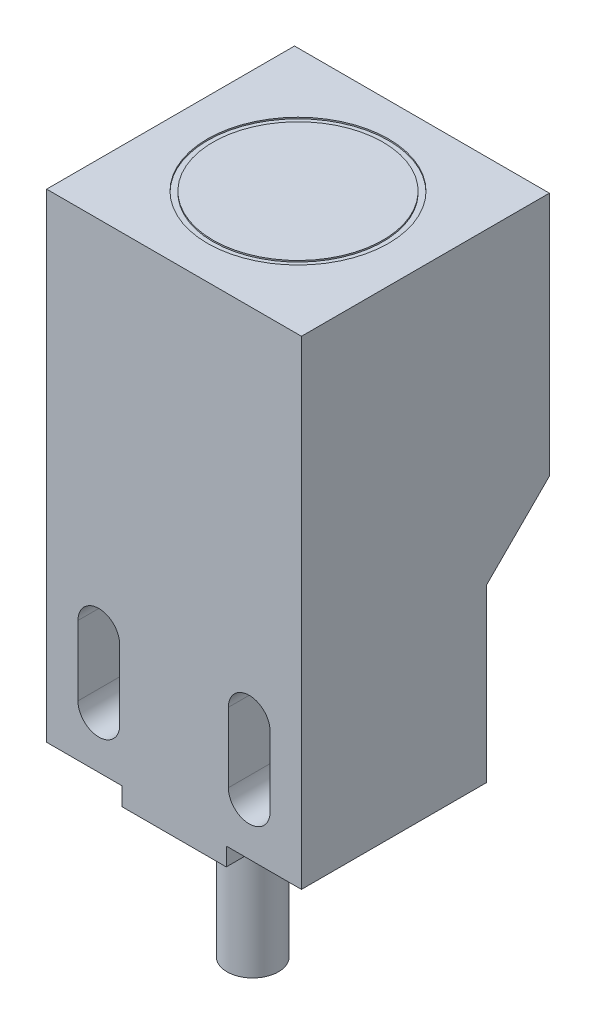
ISO-10303-21;
HEADER;
FILE_DESCRIPTION(('STEP AP214'),'2;1');
FILE_NAME('part.step','',(''),(''),'','','');
FILE_SCHEMA(('AUTOMOTIVE_DESIGN { 1 0 10303 214 1 1 1 1 }'));
ENDSEC;
DATA;
#1=APPLICATION_CONTEXT('core data for automotive mechanical design processes');
#2=APPLICATION_PROTOCOL_DEFINITION('international standard','automotive_design',2000,#1);
#3=PRODUCT_CONTEXT('',#1,'mechanical');
#4=PRODUCT('Part','Part','',(#3));
#5=PRODUCT_RELATED_PRODUCT_CATEGORY('part','',(#4));
#6=PRODUCT_DEFINITION_FORMATION('','',#4);
#7=PRODUCT_DEFINITION_CONTEXT('part definition',#1,'design');
#8=PRODUCT_DEFINITION('design','',#6,#7);
#9=PRODUCT_DEFINITION_SHAPE('','',#8);
#10=(LENGTH_UNIT() NAMED_UNIT(*) SI_UNIT(.MILLI.,.METRE.));
#11=(NAMED_UNIT(*) PLANE_ANGLE_UNIT() SI_UNIT($,.RADIAN.));
#12=(NAMED_UNIT(*) SI_UNIT($,.STERADIAN.) SOLID_ANGLE_UNIT());
#13=UNCERTAINTY_MEASURE_WITH_UNIT(LENGTH_MEASURE(1.E-05),#10,'distance_accuracy_value','');
#14=(GEOMETRIC_REPRESENTATION_CONTEXT(3) GLOBAL_UNCERTAINTY_ASSIGNED_CONTEXT((#13)) GLOBAL_UNIT_ASSIGNED_CONTEXT((#10,
#11,#12)) REPRESENTATION_CONTEXT('',''));
#15=CARTESIAN_POINT('',(0.,0.,0.));
#16=DIRECTION('',(0.,0.,1.));
#17=DIRECTION('',(1.,0.,0.));
#18=AXIS2_PLACEMENT_3D('',#15,#16,#17);
#19=CARTESIAN_POINT('',(0.,-34.4,0.));
#20=DIRECTION('',(0.,1.,0.));
#21=DIRECTION('',(0.,0.,1.));
#22=AXIS2_PLACEMENT_3D('',#19,#20,#21);
#23=PLANE('',#22);
#24=DIRECTION('',(0.,0.,1.));
#25=VECTOR('',#24,1.);
#26=CARTESIAN_POINT('',(3.75,-34.4,8.9));
#27=LINE('',#26,#25);
#28=CARTESIAN_POINT('',(3.75,-34.4,3.25));
#29=VERTEX_POINT('',#28);
#30=CARTESIAN_POINT('',(3.75,-34.4,8.9));
#31=VERTEX_POINT('',#30);
#32=EDGE_CURVE('E51',#29,#31,#27,.T.);
#33=ORIENTED_EDGE('',*,*,#32,.F.);
#34=CARTESIAN_POINT('',(0.,-34.4,3.25));
#35=DIRECTION('',(0.,-1.,0.));
#36=DIRECTION('',(0.,0.,-1.));
#37=AXIS2_PLACEMENT_3D('',#34,#35,#36);
#38=CIRCLE('',#37,3.75);
#39=CARTESIAN_POINT('',(-3.75,-34.4,3.25));
#40=VERTEX_POINT('',#39);
#41=EDGE_CURVE('E507',#40,#29,#38,.T.);
#42=ORIENTED_EDGE('',*,*,#41,.F.);
#43=DIRECTION('',(0.,0.,-1.));
#44=VECTOR('',#43,1.);
#45=CARTESIAN_POINT('',(-3.75,-34.4,8.9));
#46=LINE('',#45,#44);
#47=CARTESIAN_POINT('',(-3.75,-34.4,8.9));
#48=VERTEX_POINT('',#47);
#49=EDGE_CURVE('E501',#48,#40,#46,.T.);
#50=ORIENTED_EDGE('',*,*,#49,.F.);
#51=DIRECTION('',(1.,0.,0.));
#52=VECTOR('',#51,1.);
#53=CARTESIAN_POINT('',(-9.15,-34.4,8.9));
#54=LINE('',#53,#52);
#55=CARTESIAN_POINT('',(-9.15,-34.4,8.9));
#56=VERTEX_POINT('',#55);
#57=EDGE_CURVE('E209',#56,#48,#54,.T.);
#58=ORIENTED_EDGE('',*,*,#57,.F.);
#59=DIRECTION('',(0.,0.,1.));
#60=VECTOR('',#59,1.);
#61=CARTESIAN_POINT('',(-9.15,-34.4,-8.9));
#62=LINE('',#61,#60);
#63=CARTESIAN_POINT('',(-9.15,-34.4,-4.4));
#64=VERTEX_POINT('',#63);
#65=EDGE_CURVE('E289',#64,#56,#62,.T.);
#66=ORIENTED_EDGE('',*,*,#65,.F.);
#67=DIRECTION('',(1.,0.,0.));
#68=VECTOR('',#67,1.);
#69=CARTESIAN_POINT('',(-9.15,-34.4,-4.4));
#70=LINE('',#69,#68);
#71=CARTESIAN_POINT('',(9.15,-34.4,-4.4));
#72=VERTEX_POINT('',#71);
#73=EDGE_CURVE('E280',#64,#72,#70,.T.);
#74=ORIENTED_EDGE('',*,*,#73,.T.);
#75=DIRECTION('',(0.,0.,-1.));
#76=VECTOR('',#75,1.);
#77=CARTESIAN_POINT('',(9.15,-34.4,-8.9));
#78=LINE('',#77,#76);
#79=CARTESIAN_POINT('',(9.15,-34.4,8.9));
#80=VERTEX_POINT('',#79);
#81=EDGE_CURVE('E293',#80,#72,#78,.T.);
#82=ORIENTED_EDGE('',*,*,#81,.F.);
#83=EDGE_CURVE('E56',#31,#80,#54,.T.);
#84=ORIENTED_EDGE('',*,*,#83,.F.);
#85=EDGE_LOOP('',(#33,#42,#50,#58,#66,#74,#82,#84));
#86=FACE_BOUND('',#85,.T.);
#87=ADVANCED_FACE('F35',(#86),#23,.F.);
#88=CARTESIAN_POINT('',(-9.15,-17.6,-8.9));
#89=DIRECTION('',(0.,0.707106781186544,0.707106781186551));
#90=DIRECTION('',(0.,-0.707106781186551,0.707106781186544));
#91=AXIS2_PLACEMENT_3D('',#88,#89,#90);
#92=PLANE('',#91);
#93=CARTESIAN_POINT('',(0.,-19.85,-6.65));
#94=DIRECTION('',(0.,0.707106781186544,0.707106781186551));
#95=DIRECTION('',(0.,-0.707106781186551,0.707106781186544));
#96=AXIS2_PLACEMENT_3D('',#93,#94,#95);
#97=ELLIPSE('',#96,3.46482322781406,2.45);
#98=CARTESIAN_POINT('',(-2.44948974278318,-19.9,-6.6));
#99=VERTEX_POINT('',#98);
#100=CARTESIAN_POINT('',(-1.34164078649984,-17.8,-8.7));
#101=VERTEX_POINT('',#100);
#102=EDGE_CURVE('E222',#99,#101,#97,.F.);
#103=ORIENTED_EDGE('',*,*,#102,.F.);
#104=DIRECTION('',(-1.,0.,0.));
#105=VECTOR('',#104,1.);
#106=CARTESIAN_POINT('',(-9.15,-19.9,-6.6));
#107=LINE('',#106,#105);
#108=CARTESIAN_POINT('',(-4.24970587217516,-19.9,-6.6));
#109=VERTEX_POINT('',#108);
#110=EDGE_CURVE('E338',#99,#109,#107,.T.);
#111=ORIENTED_EDGE('',*,*,#110,.T.);
#112=CARTESIAN_POINT('',(0.,-19.85,-6.65));
#113=DIRECTION('',(0.,0.707106781186544,0.707106781186551));
#114=DIRECTION('',(0.,-0.707106781186551,0.707106781186544));
#115=AXIS2_PLACEMENT_3D('',#112,#113,#114);
#116=ELLIPSE('',#115,6.01040764008562,4.25);
#117=CARTESIAN_POINT('',(-3.60555127546397,-22.1000000000001,-4.4));
#118=VERTEX_POINT('',#117);
#119=EDGE_CURVE('E342',#118,#109,#116,.F.);
#120=ORIENTED_EDGE('',*,*,#119,.F.);
#121=DIRECTION('',(1.,0.,0.));
#122=VECTOR('',#121,1.);
#123=CARTESIAN_POINT('',(-9.15,-22.1000000000001,-4.4));
#124=LINE('',#123,#122);
#125=CARTESIAN_POINT('',(-9.15,-22.1000000000001,-4.4));
#126=VERTEX_POINT('',#125);
#127=EDGE_CURVE('E284',#126,#118,#124,.T.);
#128=ORIENTED_EDGE('',*,*,#127,.F.);
#129=DIRECTION('',(0.,-0.707106781186551,0.707106781186544));
#130=VECTOR('',#129,1.);
#131=CARTESIAN_POINT('',(-9.15,-17.6,-8.9));
#132=LINE('',#131,#130);
#133=CARTESIAN_POINT('',(-9.15,-17.6,-8.9));
#134=VERTEX_POINT('',#133);
#135=EDGE_CURVE('E273',#134,#126,#132,.T.);
#136=ORIENTED_EDGE('',*,*,#135,.F.);
#137=DIRECTION('',(1.,0.,0.));
#138=VECTOR('',#137,1.);
#139=CARTESIAN_POINT('',(-9.15,-17.6,-8.9));
#140=LINE('',#139,#138);
#141=CARTESIAN_POINT('',(9.15,-17.6,-8.9));
#142=VERTEX_POINT('',#141);
#143=EDGE_CURVE('E279',#134,#142,#140,.T.);
#144=ORIENTED_EDGE('',*,*,#143,.T.);
#145=DIRECTION('',(0.,-0.707106781186551,0.707106781186544));
#146=VECTOR('',#145,1.);
#147=CARTESIAN_POINT('',(9.15,-17.6,-8.9));
#148=LINE('',#147,#146);
#149=CARTESIAN_POINT('',(9.15,-22.1000000000001,-4.4));
#150=VERTEX_POINT('',#149);
#151=EDGE_CURVE('E244',#142,#150,#148,.T.);
#152=ORIENTED_EDGE('',*,*,#151,.T.);
#153=CARTESIAN_POINT('',(3.60555127546397,-22.1000000000001,-4.4));
#154=VERTEX_POINT('',#153);
#155=EDGE_CURVE('E287',#154,#150,#124,.T.);
#156=ORIENTED_EDGE('',*,*,#155,.F.);
#157=CARTESIAN_POINT('',(4.24970587217516,-19.9,-6.6));
#158=VERTEX_POINT('',#157);
#159=EDGE_CURVE('E341',#158,#154,#116,.F.);
#160=ORIENTED_EDGE('',*,*,#159,.F.);
#161=CARTESIAN_POINT('',(2.44948974278318,-19.9,-6.6));
#162=VERTEX_POINT('',#161);
#163=EDGE_CURVE('E339',#158,#162,#107,.T.);
#164=ORIENTED_EDGE('',*,*,#163,.T.);
#165=CARTESIAN_POINT('',(1.34164078649984,-17.8,-8.7));
#166=VERTEX_POINT('',#165);
#167=EDGE_CURVE('E219',#166,#162,#97,.F.);
#168=ORIENTED_EDGE('',*,*,#167,.F.);
#169=DIRECTION('',(-1.,0.,0.));
#170=VECTOR('',#169,1.);
#171=CARTESIAN_POINT('',(-9.15,-17.8,-8.7));
#172=LINE('',#171,#170);
#173=EDGE_CURVE('E39',#166,#101,#172,.T.);
#174=ORIENTED_EDGE('',*,*,#173,.T.);
#175=EDGE_LOOP('',(#103,#111,#120,#128,#136,#144,#152,#156,#160,#164,#168,#174));
#176=FACE_BOUND('',#175,.T.);
#177=ADVANCED_FACE('F353',(#176),#92,.F.);
#178=CARTESIAN_POINT('',(-9.15,-34.4,-8.9));
#179=DIRECTION('',(-1.,0.,0.));
#180=DIRECTION('',(0.,0.,1.));
#181=AXIS2_PLACEMENT_3D('',#178,#179,#180);
#182=PLANE('',#181);
#183=DIRECTION('',(0.,-1.,0.));
#184=VECTOR('',#183,1.);
#185=CARTESIAN_POINT('',(-9.15,-22.1000000000001,-4.4));
#186=LINE('',#185,#184);
#187=EDGE_CURVE('E276',#126,#64,#186,.T.);
#188=ORIENTED_EDGE('',*,*,#187,.T.);
#189=ORIENTED_EDGE('',*,*,#65,.T.);
#190=DIRECTION('',(0.,1.,0.));
#191=VECTOR('',#190,1.);
#192=CARTESIAN_POINT('',(-9.15,-34.4,8.9));
#193=LINE('',#192,#191);
#194=CARTESIAN_POINT('',(-9.15,0.,8.9));
#195=VERTEX_POINT('',#194);
#196=EDGE_CURVE('E296',#56,#195,#193,.T.);
#197=ORIENTED_EDGE('',*,*,#196,.T.);
#198=DIRECTION('',(0.,0.,1.));
#199=VECTOR('',#198,1.);
#200=CARTESIAN_POINT('',(-9.15,0.,-8.9));
#201=LINE('',#200,#199);
#202=CARTESIAN_POINT('',(-9.15,0.,-8.9));
#203=VERTEX_POINT('',#202);
#204=EDGE_CURVE('E283',#203,#195,#201,.T.);
#205=ORIENTED_EDGE('',*,*,#204,.F.);
#206=DIRECTION('',(0.,1.,0.));
#207=VECTOR('',#206,1.);
#208=CARTESIAN_POINT('',(-9.15,-34.4,-8.9));
#209=LINE('',#208,#207);
#210=EDGE_CURVE('E307',#134,#203,#209,.T.);
#211=ORIENTED_EDGE('',*,*,#210,.F.);
#212=ORIENTED_EDGE('',*,*,#135,.T.);
#213=EDGE_LOOP('',(#188,#189,#197,#205,#211,#212));
#214=FACE_BOUND('',#213,.T.);
#215=ADVANCED_FACE('F37',(#214),#182,.T.);
#216=CARTESIAN_POINT('',(-9.15,-34.4,-8.9));
#217=DIRECTION('',(0.,0.,-1.));
#218=DIRECTION('',(-1.,0.,0.));
#219=AXIS2_PLACEMENT_3D('',#216,#217,#218);
#220=PLANE('',#219);
#221=ORIENTED_EDGE('',*,*,#143,.F.);
#222=ORIENTED_EDGE('',*,*,#210,.T.);
#223=DIRECTION('',(-1.,0.,0.));
#224=VECTOR('',#223,1.);
#225=CARTESIAN_POINT('',(-9.15,0.,-8.9));
#226=LINE('',#225,#224);
#227=CARTESIAN_POINT('',(9.15,0.,-8.9));
#228=VERTEX_POINT('',#227);
#229=EDGE_CURVE('E291',#228,#203,#226,.T.);
#230=ORIENTED_EDGE('',*,*,#229,.F.);
#231=DIRECTION('',(0.,1.,0.));
#232=VECTOR('',#231,1.);
#233=CARTESIAN_POINT('',(9.15,-34.4,-8.9));
#234=LINE('',#233,#232);
#235=EDGE_CURVE('E310',#142,#228,#234,.T.);
#236=ORIENTED_EDGE('',*,*,#235,.F.);
#237=EDGE_LOOP('',(#221,#222,#230,#236));
#238=FACE_BOUND('',#237,.T.);
#239=ADVANCED_FACE('F378',(#238),#220,.T.);
#240=CARTESIAN_POINT('',(9.15,-34.4,-8.9));
#241=DIRECTION('',(1.,0.,0.));
#242=DIRECTION('',(0.,0.,-1.));
#243=AXIS2_PLACEMENT_3D('',#240,#241,#242);
#244=PLANE('',#243);
#245=DIRECTION('',(0.,-1.,0.));
#246=VECTOR('',#245,1.);
#247=CARTESIAN_POINT('',(9.15,-22.1000000000001,-4.4));
#248=LINE('',#247,#246);
#249=EDGE_CURVE('E271',#150,#72,#248,.T.);
#250=ORIENTED_EDGE('',*,*,#249,.F.);
#251=ORIENTED_EDGE('',*,*,#151,.F.);
#252=ORIENTED_EDGE('',*,*,#235,.T.);
#253=DIRECTION('',(0.,0.,-1.));
#254=VECTOR('',#253,1.);
#255=CARTESIAN_POINT('',(9.15,0.,-8.9));
#256=LINE('',#255,#254);
#257=CARTESIAN_POINT('',(9.15,0.,8.9));
#258=VERTEX_POINT('',#257);
#259=EDGE_CURVE('E302',#258,#228,#256,.T.);
#260=ORIENTED_EDGE('',*,*,#259,.F.);
#261=DIRECTION('',(0.,1.,0.));
#262=VECTOR('',#261,1.);
#263=CARTESIAN_POINT('',(9.15,-34.4,8.9));
#264=LINE('',#263,#262);
#265=EDGE_CURVE('E312',#80,#258,#264,.T.);
#266=ORIENTED_EDGE('',*,*,#265,.F.);
#267=ORIENTED_EDGE('',*,*,#81,.T.);
#268=EDGE_LOOP('',(#250,#251,#252,#260,#266,#267));
#269=FACE_BOUND('',#268,.T.);
#270=ADVANCED_FACE('F381',(#269),#244,.T.);
#271=CARTESIAN_POINT('',(-9.15,-34.4,8.9));
#272=DIRECTION('',(0.,0.,1.));
#273=DIRECTION('',(1.,0.,0.));
#274=AXIS2_PLACEMENT_3D('',#271,#272,#273);
#275=PLANE('',#274);
#276=CARTESIAN_POINT('',(5.4,-30.7,8.9));
#277=DIRECTION('',(0.,0.,1.));
#278=DIRECTION('',(1.,0.,0.));
#279=AXIS2_PLACEMENT_3D('',#276,#277,#278);
#280=CIRCLE('',#279,1.5);
#281=CARTESIAN_POINT('',(3.9,-30.7,8.9));
#282=VERTEX_POINT('',#281);
#283=CARTESIAN_POINT('',(6.89999999999999,-30.7,8.9));
#284=VERTEX_POINT('',#283);
#285=EDGE_CURVE('E229',#282,#284,#280,.T.);
#286=ORIENTED_EDGE('',*,*,#285,.F.);
#287=DIRECTION('',(0.,-1.,0.));
#288=VECTOR('',#287,1.);
#289=CARTESIAN_POINT('',(3.9,-30.7,8.9));
#290=LINE('',#289,#288);
#291=CARTESIAN_POINT('',(3.9,-25.7,8.9));
#292=VERTEX_POINT('',#291);
#293=EDGE_CURVE('E238',#292,#282,#290,.T.);
#294=ORIENTED_EDGE('',*,*,#293,.F.);
#295=CARTESIAN_POINT('',(5.4,-25.7,8.9));
#296=DIRECTION('',(0.,0.,1.));
#297=DIRECTION('',(1.,0.,0.));
#298=AXIS2_PLACEMENT_3D('',#295,#296,#297);
#299=CIRCLE('',#298,1.5);
#300=CARTESIAN_POINT('',(6.89999999999999,-25.7,8.9));
#301=VERTEX_POINT('',#300);
#302=EDGE_CURVE('E235',#301,#292,#299,.T.);
#303=ORIENTED_EDGE('',*,*,#302,.F.);
#304=DIRECTION('',(0.,1.,0.));
#305=VECTOR('',#304,1.);
#306=CARTESIAN_POINT('',(6.89999999999999,-30.7,8.9));
#307=LINE('',#306,#305);
#308=EDGE_CURVE('E231',#284,#301,#307,.T.);
#309=ORIENTED_EDGE('',*,*,#308,.F.);
#310=EDGE_LOOP('',(#286,#294,#303,#309));
#311=FACE_BOUND('',#310,.T.);
#312=CARTESIAN_POINT('',(-5.4,-30.7,8.9));
#313=DIRECTION('',(0.,0.,1.));
#314=DIRECTION('',(-1.,0.,0.));
#315=AXIS2_PLACEMENT_3D('',#312,#313,#314);
#316=CIRCLE('',#315,1.5);
#317=CARTESIAN_POINT('',(-6.89999999999999,-30.7,8.9));
#318=VERTEX_POINT('',#317);
#319=CARTESIAN_POINT('',(-3.9,-30.7,8.9));
#320=VERTEX_POINT('',#319);
#321=EDGE_CURVE('E226',#318,#320,#316,.T.);
#322=ORIENTED_EDGE('',*,*,#321,.F.);
#323=DIRECTION('',(0.,-1.,0.));
#324=VECTOR('',#323,1.);
#325=CARTESIAN_POINT('',(-6.89999999999999,-30.7,8.9));
#326=LINE('',#325,#324);
#327=CARTESIAN_POINT('',(-6.89999999999999,-25.7,8.9));
#328=VERTEX_POINT('',#327);
#329=EDGE_CURVE('E258',#328,#318,#326,.T.);
#330=ORIENTED_EDGE('',*,*,#329,.F.);
#331=CARTESIAN_POINT('',(-5.4,-25.7,8.9));
#332=DIRECTION('',(0.,0.,1.));
#333=DIRECTION('',(-1.,0.,0.));
#334=AXIS2_PLACEMENT_3D('',#331,#332,#333);
#335=CIRCLE('',#334,1.5);
#336=CARTESIAN_POINT('',(-3.9,-25.7,8.9));
#337=VERTEX_POINT('',#336);
#338=EDGE_CURVE('E255',#337,#328,#335,.T.);
#339=ORIENTED_EDGE('',*,*,#338,.F.);
#340=DIRECTION('',(0.,1.,0.));
#341=VECTOR('',#340,1.);
#342=CARTESIAN_POINT('',(-3.9,-30.7,8.9));
#343=LINE('',#342,#341);
#344=EDGE_CURVE('E252',#320,#337,#343,.T.);
#345=ORIENTED_EDGE('',*,*,#344,.F.);
#346=EDGE_LOOP('',(#322,#330,#339,#345));
#347=FACE_BOUND('',#346,.T.);
#348=DIRECTION('',(1.,0.,0.));
#349=VECTOR('',#348,1.);
#350=CARTESIAN_POINT('',(-9.15,0.,8.9));
#351=LINE('',#350,#349);
#352=EDGE_CURVE('E299',#195,#258,#351,.T.);
#353=ORIENTED_EDGE('',*,*,#352,.F.);
#354=ORIENTED_EDGE('',*,*,#196,.F.);
#355=ORIENTED_EDGE('',*,*,#57,.T.);
#356=DIRECTION('',(0.,1.,0.));
#357=VECTOR('',#356,1.);
#358=CARTESIAN_POINT('',(-3.75,-35.7,8.9));
#359=LINE('',#358,#357);
#360=CARTESIAN_POINT('',(-3.75,-35.7,8.9));
#361=VERTEX_POINT('',#360);
#362=EDGE_CURVE('E188',#361,#48,#359,.T.);
#363=ORIENTED_EDGE('',*,*,#362,.F.);
#364=DIRECTION('',(-1.,0.,0.));
#365=VECTOR('',#364,1.);
#366=CARTESIAN_POINT('',(-3.75,-35.7,8.9));
#367=LINE('',#366,#365);
#368=CARTESIAN_POINT('',(3.75,-35.7,8.9));
#369=VERTEX_POINT('',#368);
#370=EDGE_CURVE('E194',#369,#361,#367,.T.);
#371=ORIENTED_EDGE('',*,*,#370,.F.);
#372=DIRECTION('',(0.,1.,0.));
#373=VECTOR('',#372,1.);
#374=CARTESIAN_POINT('',(3.75,-35.7,8.9));
#375=LINE('',#374,#373);
#376=EDGE_CURVE('E505',#369,#31,#375,.T.);
#377=ORIENTED_EDGE('',*,*,#376,.T.);
#378=ORIENTED_EDGE('',*,*,#83,.T.);
#379=ORIENTED_EDGE('',*,*,#265,.T.);
#380=EDGE_LOOP('',(#353,#354,#355,#363,#371,#377,#378,#379));
#381=FACE_BOUND('',#380,.T.);
#382=ADVANCED_FACE('F206',(#311,#347,#381),#275,.T.);
#383=CARTESIAN_POINT('',(0.,0.,0.));
#384=DIRECTION('',(0.,1.,0.));
#385=DIRECTION('',(0.,0.,1.));
#386=AXIS2_PLACEMENT_3D('',#383,#384,#385);
#387=PLANE('',#386);
#388=CARTESIAN_POINT('',(0.,0.,0.));
#389=DIRECTION('',(0.,1.,0.));
#390=DIRECTION('',(0.,0.,1.));
#391=AXIS2_PLACEMENT_3D('',#388,#389,#390);
#392=CIRCLE('',#391,6.5);
#393=CARTESIAN_POINT('',(0.,0.,6.5));
#394=VERTEX_POINT('',#393);
#395=EDGE_CURVE('E491',#394,#394,#392,.T.);
#396=ORIENTED_EDGE('',*,*,#395,.F.);
#397=EDGE_LOOP('',(#396));
#398=FACE_BOUND('',#397,.T.);
#399=ORIENTED_EDGE('',*,*,#204,.T.);
#400=ORIENTED_EDGE('',*,*,#352,.T.);
#401=ORIENTED_EDGE('',*,*,#259,.T.);
#402=ORIENTED_EDGE('',*,*,#229,.T.);
#403=EDGE_LOOP('',(#399,#400,#401,#402));
#404=FACE_BOUND('',#403,.T.);
#405=ADVANCED_FACE('F385',(#398,#404),#387,.T.);
#406=CARTESIAN_POINT('',(-9.15,-22.1000000000001,-4.4));
#407=DIRECTION('',(0.,0.,1.));
#408=DIRECTION('',(0.,-1.,0.));
#409=AXIS2_PLACEMENT_3D('',#406,#407,#408);
#410=PLANE('',#409);
#411=CARTESIAN_POINT('',(0.,-19.85,-4.4));
#412=DIRECTION('',(0.,0.,-1.));
#413=DIRECTION('',(0.,1.,0.));
#414=AXIS2_PLACEMENT_3D('',#411,#412,#413);
#415=CIRCLE('',#414,4.25);
#416=EDGE_CURVE('E227',#154,#118,#415,.T.);
#417=ORIENTED_EDGE('',*,*,#416,.F.);
#418=ORIENTED_EDGE('',*,*,#155,.T.);
#419=ORIENTED_EDGE('',*,*,#249,.T.);
#420=ORIENTED_EDGE('',*,*,#73,.F.);
#421=ORIENTED_EDGE('',*,*,#187,.F.);
#422=ORIENTED_EDGE('',*,*,#127,.T.);
#423=EDGE_LOOP('',(#417,#418,#419,#420,#421,#422));
#424=FACE_BOUND('',#423,.T.);
#425=DIRECTION('',(0.,-1.,0.));
#426=VECTOR('',#425,1.);
#427=CARTESIAN_POINT('',(3.9,-22.1000000000001,-4.4));
#428=LINE('',#427,#426);
#429=CARTESIAN_POINT('',(3.9,-25.7,-4.4));
#430=VERTEX_POINT('',#429);
#431=CARTESIAN_POINT('',(3.9,-30.7,-4.4));
#432=VERTEX_POINT('',#431);
#433=EDGE_CURVE('E332',#430,#432,#428,.T.);
#434=ORIENTED_EDGE('',*,*,#433,.T.);
#435=CARTESIAN_POINT('',(5.4,-30.7,-4.4));
#436=DIRECTION('',(0.,0.,1.));
#437=DIRECTION('',(0.,-1.,0.));
#438=AXIS2_PLACEMENT_3D('',#435,#436,#437);
#439=CIRCLE('',#438,1.5);
#440=CARTESIAN_POINT('',(6.89999999999999,-30.7,-4.4));
#441=VERTEX_POINT('',#440);
#442=EDGE_CURVE('E335',#432,#441,#439,.T.);
#443=ORIENTED_EDGE('',*,*,#442,.T.);
#444=DIRECTION('',(0.,1.,0.));
#445=VECTOR('',#444,1.);
#446=CARTESIAN_POINT('',(6.9,-22.1,-4.4));
#447=LINE('',#446,#445);
#448=CARTESIAN_POINT('',(6.9,-25.7,-4.4));
#449=VERTEX_POINT('',#448);
#450=EDGE_CURVE('E326',#441,#449,#447,.T.);
#451=ORIENTED_EDGE('',*,*,#450,.T.);
#452=CARTESIAN_POINT('',(5.4,-25.7,-4.4));
#453=DIRECTION('',(0.,0.,1.));
#454=DIRECTION('',(0.,-1.,0.));
#455=AXIS2_PLACEMENT_3D('',#452,#453,#454);
#456=CIRCLE('',#455,1.5);
#457=EDGE_CURVE('E329',#449,#430,#456,.T.);
#458=ORIENTED_EDGE('',*,*,#457,.T.);
#459=EDGE_LOOP('',(#434,#443,#451,#458));
#460=FACE_BOUND('',#459,.T.);
#461=DIRECTION('',(0.,-1.,0.));
#462=VECTOR('',#461,1.);
#463=CARTESIAN_POINT('',(-6.89999999999999,-22.1000000000001,-4.4));
#464=LINE('',#463,#462);
#465=CARTESIAN_POINT('',(-6.89999999999999,-25.7,-4.4));
#466=VERTEX_POINT('',#465);
#467=CARTESIAN_POINT('',(-6.89999999999999,-30.7,-4.4));
#468=VERTEX_POINT('',#467);
#469=EDGE_CURVE('E320',#466,#468,#464,.T.);
#470=ORIENTED_EDGE('',*,*,#469,.T.);
#471=CARTESIAN_POINT('',(-5.4,-30.7,-4.4));
#472=DIRECTION('',(0.,0.,1.));
#473=DIRECTION('',(0.,-1.,0.));
#474=AXIS2_PLACEMENT_3D('',#471,#472,#473);
#475=CIRCLE('',#474,1.5);
#476=CARTESIAN_POINT('',(-3.9,-30.7,-4.4));
#477=VERTEX_POINT('',#476);
#478=EDGE_CURVE('E323',#468,#477,#475,.T.);
#479=ORIENTED_EDGE('',*,*,#478,.T.);
#480=DIRECTION('',(0.,1.,0.));
#481=VECTOR('',#480,1.);
#482=CARTESIAN_POINT('',(-3.9,-22.1000000000001,-4.4));
#483=LINE('',#482,#481);
#484=CARTESIAN_POINT('',(-3.9,-25.7,-4.4));
#485=VERTEX_POINT('',#484);
#486=EDGE_CURVE('E309',#477,#485,#483,.T.);
#487=ORIENTED_EDGE('',*,*,#486,.T.);
#488=CARTESIAN_POINT('',(-5.4,-25.7,-4.4));
#489=DIRECTION('',(0.,0.,1.));
#490=DIRECTION('',(0.,-1.,0.));
#491=AXIS2_PLACEMENT_3D('',#488,#489,#490);
#492=CIRCLE('',#491,1.5);
#493=EDGE_CURVE('E317',#485,#466,#492,.T.);
#494=ORIENTED_EDGE('',*,*,#493,.T.);
#495=EDGE_LOOP('',(#470,#479,#487,#494));
#496=FACE_BOUND('',#495,.T.);
#497=ADVANCED_FACE('F367',(#424,#460,#496),#410,.F.);
#498=CARTESIAN_POINT('',(-5.4,-30.7,-8.9));
#499=DIRECTION('',(0.,0.,1.));
#500=DIRECTION('',(1.,0.,0.));
#501=AXIS2_PLACEMENT_3D('',#498,#499,#500);
#502=CYLINDRICAL_SURFACE('',#501,1.5);
#503=DIRECTION('',(0.,0.,1.));
#504=VECTOR('',#503,1.);
#505=CARTESIAN_POINT('',(-6.89999999999999,-30.7,-8.9));
#506=LINE('',#505,#504);
#507=EDGE_CURVE('E232',#468,#318,#506,.T.);
#508=ORIENTED_EDGE('',*,*,#507,.T.);
#509=ORIENTED_EDGE('',*,*,#321,.T.);
#510=DIRECTION('',(0.,0.,1.));
#511=VECTOR('',#510,1.);
#512=CARTESIAN_POINT('',(-3.9,-30.7,-8.9));
#513=LINE('',#512,#511);
#514=EDGE_CURVE('E261',#477,#320,#513,.T.);
#515=ORIENTED_EDGE('',*,*,#514,.F.);
#516=ORIENTED_EDGE('',*,*,#478,.F.);
#517=EDGE_LOOP('',(#508,#509,#515,#516));
#518=FACE_BOUND('',#517,.T.);
#519=ADVANCED_FACE('F395',(#518),#502,.F.);
#520=CARTESIAN_POINT('',(-6.89999999999999,-30.7,-8.9));
#521=DIRECTION('',(-1.,0.,0.));
#522=DIRECTION('',(0.,-1.,0.));
#523=AXIS2_PLACEMENT_3D('',#520,#521,#522);
#524=PLANE('',#523);
#525=DIRECTION('',(0.,0.,1.));
#526=VECTOR('',#525,1.);
#527=CARTESIAN_POINT('',(-6.89999999999999,-25.7,-8.9));
#528=LINE('',#527,#526);
#529=EDGE_CURVE('E263',#466,#328,#528,.T.);
#530=ORIENTED_EDGE('',*,*,#529,.T.);
#531=ORIENTED_EDGE('',*,*,#329,.T.);
#532=ORIENTED_EDGE('',*,*,#507,.F.);
#533=ORIENTED_EDGE('',*,*,#469,.F.);
#534=EDGE_LOOP('',(#530,#531,#532,#533));
#535=FACE_BOUND('',#534,.T.);
#536=ADVANCED_FACE('F413',(#535),#524,.F.);
#537=CARTESIAN_POINT('',(-5.4,-25.7,-8.9));
#538=DIRECTION('',(0.,0.,1.));
#539=DIRECTION('',(1.,0.,0.));
#540=AXIS2_PLACEMENT_3D('',#537,#538,#539);
#541=CYLINDRICAL_SURFACE('',#540,1.5);
#542=DIRECTION('',(0.,0.,1.));
#543=VECTOR('',#542,1.);
#544=CARTESIAN_POINT('',(-3.9,-25.7,-8.9));
#545=LINE('',#544,#543);
#546=EDGE_CURVE('E265',#485,#337,#545,.T.);
#547=ORIENTED_EDGE('',*,*,#546,.T.);
#548=ORIENTED_EDGE('',*,*,#338,.T.);
#549=ORIENTED_EDGE('',*,*,#529,.F.);
#550=ORIENTED_EDGE('',*,*,#493,.F.);
#551=EDGE_LOOP('',(#547,#548,#549,#550));
#552=FACE_BOUND('',#551,.T.);
#553=ADVANCED_FACE('F419',(#552),#541,.F.);
#554=CARTESIAN_POINT('',(-3.9,-30.7,-8.9));
#555=DIRECTION('',(1.,0.,0.));
#556=DIRECTION('',(0.,1.,0.));
#557=AXIS2_PLACEMENT_3D('',#554,#555,#556);
#558=PLANE('',#557);
#559=ORIENTED_EDGE('',*,*,#514,.T.);
#560=ORIENTED_EDGE('',*,*,#344,.T.);
#561=ORIENTED_EDGE('',*,*,#546,.F.);
#562=ORIENTED_EDGE('',*,*,#486,.F.);
#563=EDGE_LOOP('',(#559,#560,#561,#562));
#564=FACE_BOUND('',#563,.T.);
#565=ADVANCED_FACE('F415',(#564),#558,.F.);
#566=CARTESIAN_POINT('',(5.4,-30.7,-8.9));
#567=DIRECTION('',(0.,0.,1.));
#568=DIRECTION('',(1.,0.,0.));
#569=AXIS2_PLACEMENT_3D('',#566,#567,#568);
#570=CYLINDRICAL_SURFACE('',#569,1.5);
#571=DIRECTION('',(0.,0.,1.));
#572=VECTOR('',#571,1.);
#573=CARTESIAN_POINT('',(3.9,-30.7,-8.9));
#574=LINE('',#573,#572);
#575=EDGE_CURVE('E242',#432,#282,#574,.T.);
#576=ORIENTED_EDGE('',*,*,#575,.T.);
#577=ORIENTED_EDGE('',*,*,#285,.T.);
#578=DIRECTION('',(0.,0.,1.));
#579=VECTOR('',#578,1.);
#580=CARTESIAN_POINT('',(6.89999999999999,-30.7,-8.9));
#581=LINE('',#580,#579);
#582=EDGE_CURVE('E241',#441,#284,#581,.T.);
#583=ORIENTED_EDGE('',*,*,#582,.F.);
#584=ORIENTED_EDGE('',*,*,#442,.F.);
#585=EDGE_LOOP('',(#576,#577,#583,#584));
#586=FACE_BOUND('',#585,.T.);
#587=ADVANCED_FACE('F418',(#586),#570,.F.);
#588=CARTESIAN_POINT('',(3.9,-30.7,-8.9));
#589=DIRECTION('',(-1.,0.,0.));
#590=DIRECTION('',(0.,-1.,0.));
#591=AXIS2_PLACEMENT_3D('',#588,#589,#590);
#592=PLANE('',#591);
#593=DIRECTION('',(0.,0.,1.));
#594=VECTOR('',#593,1.);
#595=CARTESIAN_POINT('',(3.9,-25.7,-8.9));
#596=LINE('',#595,#594);
#597=EDGE_CURVE('E245',#430,#292,#596,.T.);
#598=ORIENTED_EDGE('',*,*,#597,.T.);
#599=ORIENTED_EDGE('',*,*,#293,.T.);
#600=ORIENTED_EDGE('',*,*,#575,.F.);
#601=ORIENTED_EDGE('',*,*,#433,.F.);
#602=EDGE_LOOP('',(#598,#599,#600,#601));
#603=FACE_BOUND('',#602,.T.);
#604=ADVANCED_FACE('F429',(#603),#592,.F.);
#605=CARTESIAN_POINT('',(5.4,-25.7,-8.9));
#606=DIRECTION('',(0.,0.,1.));
#607=DIRECTION('',(1.,0.,0.));
#608=AXIS2_PLACEMENT_3D('',#605,#606,#607);
#609=CYLINDRICAL_SURFACE('',#608,1.5);
#610=DIRECTION('',(0.,0.,1.));
#611=VECTOR('',#610,1.);
#612=CARTESIAN_POINT('',(6.89999999999999,-25.7,-8.9));
#613=LINE('',#612,#611);
#614=EDGE_CURVE('E247',#449,#301,#613,.T.);
#615=ORIENTED_EDGE('',*,*,#614,.T.);
#616=ORIENTED_EDGE('',*,*,#302,.T.);
#617=ORIENTED_EDGE('',*,*,#597,.F.);
#618=ORIENTED_EDGE('',*,*,#457,.F.);
#619=EDGE_LOOP('',(#615,#616,#617,#618));
#620=FACE_BOUND('',#619,.T.);
#621=ADVANCED_FACE('F434',(#620),#609,.F.);
#622=CARTESIAN_POINT('',(6.89999999999999,-30.7,-8.9));
#623=DIRECTION('',(1.,0.,0.));
#624=DIRECTION('',(0.,1.,0.));
#625=AXIS2_PLACEMENT_3D('',#622,#623,#624);
#626=PLANE('',#625);
#627=ORIENTED_EDGE('',*,*,#582,.T.);
#628=ORIENTED_EDGE('',*,*,#308,.T.);
#629=ORIENTED_EDGE('',*,*,#614,.F.);
#630=ORIENTED_EDGE('',*,*,#450,.F.);
#631=EDGE_LOOP('',(#627,#628,#629,#630));
#632=FACE_BOUND('',#631,.T.);
#633=ADVANCED_FACE('F431',(#632),#626,.F.);
#634=CARTESIAN_POINT('',(0.,-19.85,-6.6));
#635=DIRECTION('',(0.,0.,1.));
#636=DIRECTION('',(0.,-1.,0.));
#637=AXIS2_PLACEMENT_3D('',#634,#635,#636);
#638=CYLINDRICAL_SURFACE('',#637,4.25);
#639=ORIENTED_EDGE('',*,*,#416,.T.);
#640=ORIENTED_EDGE('',*,*,#119,.T.);
#641=CARTESIAN_POINT('',(0.,-19.85,-6.6));
#642=DIRECTION('',(0.,0.,-1.));
#643=DIRECTION('',(0.,1.,0.));
#644=AXIS2_PLACEMENT_3D('',#641,#642,#643);
#645=CIRCLE('',#644,4.25);
#646=EDGE_CURVE('E223',#158,#109,#645,.T.);
#647=ORIENTED_EDGE('',*,*,#646,.F.);
#648=ORIENTED_EDGE('',*,*,#159,.T.);
#649=EDGE_LOOP('',(#639,#640,#647,#648));
#650=FACE_BOUND('',#649,.T.);
#651=ADVANCED_FACE('F370',(#650),#638,.T.);
#652=CARTESIAN_POINT('',(0.,-19.85,-6.6));
#653=DIRECTION('',(0.,0.,-1.));
#654=DIRECTION('',(0.,1.,0.));
#655=AXIS2_PLACEMENT_3D('',#652,#653,#654);
#656=PLANE('',#655);
#657=ORIENTED_EDGE('',*,*,#110,.F.);
#658=CARTESIAN_POINT('',(0.,-19.85,-6.6));
#659=DIRECTION('',(0.,0.,-1.));
#660=DIRECTION('',(0.,1.,0.));
#661=AXIS2_PLACEMENT_3D('',#658,#659,#660);
#662=CIRCLE('',#661,2.45);
#663=EDGE_CURVE('E210',#162,#99,#662,.T.);
#664=ORIENTED_EDGE('',*,*,#663,.F.);
#665=ORIENTED_EDGE('',*,*,#163,.F.);
#666=ORIENTED_EDGE('',*,*,#646,.T.);
#667=EDGE_LOOP('',(#657,#664,#665,#666));
#668=FACE_BOUND('',#667,.T.);
#669=ADVANCED_FACE('F362',(#668),#656,.T.);
#670=CARTESIAN_POINT('',(0.,-19.85,-8.7));
#671=DIRECTION('',(0.,0.,-1.));
#672=DIRECTION('',(0.,1.,0.));
#673=AXIS2_PLACEMENT_3D('',#670,#671,#672);
#674=PLANE('',#673);
#675=ORIENTED_EDGE('',*,*,#173,.F.);
#676=CARTESIAN_POINT('',(0.,-19.85,-8.7));
#677=DIRECTION('',(0.,0.,-1.));
#678=DIRECTION('',(0.,1.,0.));
#679=AXIS2_PLACEMENT_3D('',#676,#677,#678);
#680=CIRCLE('',#679,2.45);
#681=EDGE_CURVE('E212',#166,#101,#680,.T.);
#682=ORIENTED_EDGE('',*,*,#681,.T.);
#683=EDGE_LOOP('',(#675,#682));
#684=FACE_BOUND('',#683,.T.);
#685=ADVANCED_FACE('F357',(#684),#674,.T.);
#686=CARTESIAN_POINT('',(0.,-19.85,-8.7));
#687=DIRECTION('',(0.,0.,1.));
#688=DIRECTION('',(0.,-1.,0.));
#689=AXIS2_PLACEMENT_3D('',#686,#687,#688);
#690=CYLINDRICAL_SURFACE('',#689,2.45);
#691=ORIENTED_EDGE('',*,*,#663,.T.);
#692=ORIENTED_EDGE('',*,*,#102,.T.);
#693=ORIENTED_EDGE('',*,*,#681,.F.);
#694=ORIENTED_EDGE('',*,*,#167,.T.);
#695=EDGE_LOOP('',(#691,#692,#693,#694));
#696=FACE_BOUND('',#695,.T.);
#697=ADVANCED_FACE('F359',(#696),#690,.T.);
#698=CARTESIAN_POINT('',(-3.75,-35.7,8.9));
#699=DIRECTION('',(1.,0.,0.));
#700=DIRECTION('',(0.,0.,-1.));
#701=AXIS2_PLACEMENT_3D('',#698,#699,#700);
#702=PLANE('',#701);
#703=ORIENTED_EDGE('',*,*,#49,.T.);
#704=DIRECTION('',(0.,1.,0.));
#705=VECTOR('',#704,1.);
#706=CARTESIAN_POINT('',(-3.75,-35.7,3.25));
#707=LINE('',#706,#705);
#708=CARTESIAN_POINT('',(-3.75,-35.7,3.25));
#709=VERTEX_POINT('',#708);
#710=EDGE_CURVE('E190',#709,#40,#707,.T.);
#711=ORIENTED_EDGE('',*,*,#710,.F.);
#712=DIRECTION('',(0.,0.,-1.));
#713=VECTOR('',#712,1.);
#714=CARTESIAN_POINT('',(-3.75,-35.7,8.9));
#715=LINE('',#714,#713);
#716=EDGE_CURVE('E183',#361,#709,#715,.T.);
#717=ORIENTED_EDGE('',*,*,#716,.F.);
#718=ORIENTED_EDGE('',*,*,#362,.T.);
#719=EDGE_LOOP('',(#703,#711,#717,#718));
#720=FACE_BOUND('',#719,.T.);
#721=ADVANCED_FACE('F186',(#720),#702,.F.);
#722=CARTESIAN_POINT('',(0.,-35.7,3.25));
#723=DIRECTION('',(0.,1.,0.));
#724=DIRECTION('',(0.,0.,1.));
#725=AXIS2_PLACEMENT_3D('',#722,#723,#724);
#726=CYLINDRICAL_SURFACE('',#725,3.75);
#727=ORIENTED_EDGE('',*,*,#41,.T.);
#728=DIRECTION('',(0.,1.,0.));
#729=VECTOR('',#728,1.);
#730=CARTESIAN_POINT('',(3.75,-35.7,3.25));
#731=LINE('',#730,#729);
#732=CARTESIAN_POINT('',(3.75,-35.7,3.25));
#733=VERTEX_POINT('',#732);
#734=EDGE_CURVE('E214',#733,#29,#731,.T.);
#735=ORIENTED_EDGE('',*,*,#734,.F.);
#736=CARTESIAN_POINT('',(0.,-35.7,3.25));
#737=DIRECTION('',(0.,-1.,0.));
#738=DIRECTION('',(0.,0.,-1.));
#739=AXIS2_PLACEMENT_3D('',#736,#737,#738);
#740=CIRCLE('',#739,3.75);
#741=EDGE_CURVE('E193',#709,#733,#740,.T.);
#742=ORIENTED_EDGE('',*,*,#741,.F.);
#743=ORIENTED_EDGE('',*,*,#710,.T.);
#744=EDGE_LOOP('',(#727,#735,#742,#743));
#745=FACE_BOUND('',#744,.T.);
#746=ADVANCED_FACE('F452',(#745),#726,.T.);
#747=CARTESIAN_POINT('',(3.75,-35.7,8.9));
#748=DIRECTION('',(-1.,0.,0.));
#749=DIRECTION('',(0.,0.,1.));
#750=AXIS2_PLACEMENT_3D('',#747,#748,#749);
#751=PLANE('',#750);
#752=ORIENTED_EDGE('',*,*,#32,.T.);
#753=ORIENTED_EDGE('',*,*,#376,.F.);
#754=DIRECTION('',(0.,0.,1.));
#755=VECTOR('',#754,1.);
#756=CARTESIAN_POINT('',(3.75,-35.7,8.9));
#757=LINE('',#756,#755);
#758=EDGE_CURVE('E199',#733,#369,#757,.T.);
#759=ORIENTED_EDGE('',*,*,#758,.F.);
#760=ORIENTED_EDGE('',*,*,#734,.T.);
#761=EDGE_LOOP('',(#752,#753,#759,#760));
#762=FACE_BOUND('',#761,.T.);
#763=ADVANCED_FACE('F455',(#762),#751,.F.);
#764=CARTESIAN_POINT('',(0.,-35.7,3.25));
#765=DIRECTION('',(0.,-1.,0.));
#766=DIRECTION('',(0.,0.,-1.));
#767=AXIS2_PLACEMENT_3D('',#764,#765,#766);
#768=PLANE('',#767);
#769=CARTESIAN_POINT('',(0.,-35.7,3.25));
#770=DIRECTION('',(0.,-1.,0.));
#771=DIRECTION('',(0.,0.,-1.));
#772=AXIS2_PLACEMENT_3D('',#769,#770,#771);
#773=CIRCLE('',#772,1.85);
#774=CARTESIAN_POINT('',(0.,-35.7,5.1));
#775=VERTEX_POINT('',#774);
#776=EDGE_CURVE('E11',#775,#775,#773,.T.);
#777=ORIENTED_EDGE('',*,*,#776,.F.);
#778=EDGE_LOOP('',(#777));
#779=FACE_BOUND('',#778,.T.);
#780=ORIENTED_EDGE('',*,*,#370,.T.);
#781=ORIENTED_EDGE('',*,*,#716,.T.);
#782=ORIENTED_EDGE('',*,*,#741,.T.);
#783=ORIENTED_EDGE('',*,*,#758,.T.);
#784=EDGE_LOOP('',(#780,#781,#782,#783));
#785=FACE_BOUND('',#784,.T.);
#786=ADVANCED_FACE('F197',(#779,#785),#768,.T.);
#787=CARTESIAN_POINT('',(0.,-46.,3.25));
#788=DIRECTION('',(0.,1.,0.));
#789=DIRECTION('',(0.,0.,1.));
#790=AXIS2_PLACEMENT_3D('',#787,#788,#789);
#791=CYLINDRICAL_SURFACE('',#790,1.85);
#792=CARTESIAN_POINT('',(0.,-46.,3.25));
#793=DIRECTION('',(0.,-1.,0.));
#794=DIRECTION('',(0.,0.,-1.));
#795=AXIS2_PLACEMENT_3D('',#792,#793,#794);
#796=CIRCLE('',#795,1.85);
#797=CARTESIAN_POINT('',(0.,-46.,5.1));
#798=VERTEX_POINT('',#797);
#799=EDGE_CURVE('E497',#798,#798,#796,.T.);
#800=CARTESIAN_POINT('',(0.,-46.,5.1));
#801=CARTESIAN_POINT('',(0.,-45.8927083333333,5.1));
#802=CARTESIAN_POINT('',(0.,-45.7854166666667,5.1));
#803=CARTESIAN_POINT('',(0.,-45.5708333333333,5.1));
#804=CARTESIAN_POINT('',(0.,-45.4635416666667,5.1));
#805=CARTESIAN_POINT('',(0.,-45.2489583333333,5.1));
#806=CARTESIAN_POINT('',(0.,-45.1416666666667,5.1));
#807=CARTESIAN_POINT('',(0.,-44.9270833333333,5.1));
#808=CARTESIAN_POINT('',(0.,-44.8197916666667,5.1));
#809=CARTESIAN_POINT('',(0.,-44.6052083333333,5.1));
#810=CARTESIAN_POINT('',(0.,-44.4979166666667,5.1));
#811=CARTESIAN_POINT('',(0.,-44.2833333333333,5.1));
#812=CARTESIAN_POINT('',(0.,-44.1760416666667,5.1));
#813=CARTESIAN_POINT('',(0.,-43.9614583333333,5.1));
#814=CARTESIAN_POINT('',(0.,-43.8541666666667,5.1));
#815=CARTESIAN_POINT('',(0.,-43.6395833333333,5.1));
#816=CARTESIAN_POINT('',(0.,-43.5322916666667,5.1));
#817=CARTESIAN_POINT('',(0.,-43.3177083333333,5.1));
#818=CARTESIAN_POINT('',(0.,-43.2104166666667,5.1));
#819=CARTESIAN_POINT('',(0.,-42.9958333333333,5.1));
#820=CARTESIAN_POINT('',(0.,-42.8885416666667,5.1));
#821=CARTESIAN_POINT('',(0.,-42.6739583333333,5.1));
#822=CARTESIAN_POINT('',(0.,-42.5666666666667,5.1));
#823=CARTESIAN_POINT('',(0.,-42.3520833333333,5.1));
#824=CARTESIAN_POINT('',(0.,-42.2447916666667,5.1));
#825=CARTESIAN_POINT('',(0.,-42.0302083333333,5.1));
#826=CARTESIAN_POINT('',(0.,-41.9229166666667,5.1));
#827=CARTESIAN_POINT('',(0.,-41.7083333333333,5.1));
#828=CARTESIAN_POINT('',(0.,-41.6010416666667,5.1));
#829=CARTESIAN_POINT('',(0.,-41.3864583333333,5.1));
#830=CARTESIAN_POINT('',(0.,-41.2791666666667,5.1));
#831=CARTESIAN_POINT('',(0.,-41.0645833333333,5.1));
#832=CARTESIAN_POINT('',(0.,-40.9572916666667,5.1));
#833=CARTESIAN_POINT('',(0.,-40.7427083333333,5.1));
#834=CARTESIAN_POINT('',(0.,-40.6354166666667,5.1));
#835=CARTESIAN_POINT('',(0.,-40.4208333333333,5.1));
#836=CARTESIAN_POINT('',(0.,-40.3135416666667,5.1));
#837=CARTESIAN_POINT('',(0.,-40.0989583333333,5.1));
#838=CARTESIAN_POINT('',(0.,-39.9916666666667,5.1));
#839=CARTESIAN_POINT('',(0.,-39.7770833333333,5.1));
#840=CARTESIAN_POINT('',(0.,-39.6697916666667,5.1));
#841=CARTESIAN_POINT('',(0.,-39.4552083333333,5.1));
#842=CARTESIAN_POINT('',(0.,-39.3479166666667,5.1));
#843=CARTESIAN_POINT('',(0.,-39.1333333333333,5.1));
#844=CARTESIAN_POINT('',(0.,-39.0260416666667,5.1));
#845=CARTESIAN_POINT('',(0.,-38.8114583333333,5.1));
#846=CARTESIAN_POINT('',(0.,-38.7041666666667,5.1));
#847=CARTESIAN_POINT('',(0.,-38.4895833333333,5.1));
#848=CARTESIAN_POINT('',(0.,-38.3822916666667,5.1));
#849=CARTESIAN_POINT('',(0.,-38.1677083333333,5.1));
#850=CARTESIAN_POINT('',(0.,-38.0604166666667,5.1));
#851=CARTESIAN_POINT('',(0.,-37.8458333333333,5.1));
#852=CARTESIAN_POINT('',(0.,-37.7385416666667,5.1));
#853=CARTESIAN_POINT('',(0.,-37.5239583333333,5.1));
#854=CARTESIAN_POINT('',(0.,-37.4166666666667,5.1));
#855=CARTESIAN_POINT('',(0.,-37.2020833333333,5.1));
#856=CARTESIAN_POINT('',(0.,-37.0947916666667,5.1));
#857=CARTESIAN_POINT('',(0.,-36.8802083333333,5.1));
#858=CARTESIAN_POINT('',(0.,-36.7729166666667,5.1));
#859=CARTESIAN_POINT('',(0.,-36.5583333333333,5.1));
#860=CARTESIAN_POINT('',(0.,-36.4510416666667,5.1));
#861=CARTESIAN_POINT('',(0.,-36.2364583333333,5.1));
#862=CARTESIAN_POINT('',(0.,-36.1291666666667,5.1));
#863=CARTESIAN_POINT('',(0.,-35.9145833333333,5.1));
#864=CARTESIAN_POINT('',(0.,-35.8072916666667,5.1));
#865=CARTESIAN_POINT('',(0.,-35.7,5.1));
#866=B_SPLINE_CURVE_WITH_KNOTS('',3,(#800,#801,#802,#803,#804,#805,#806,#807,#808,#809,#810,
#811,#812,#813,#814,#815,#816,#817,#818,#819,#820,#821,#822,#823,#824,#825,#826,#827,#828,#829,
#830,#831,#832,#833,#834,#835,#836,#837,#838,#839,#840,#841,#842,#843,#844,#845,#846,#847,#848,
#849,#850,#851,#852,#853,#854,#855,#856,#857,#858,#859,#860,#861,#862,#863,#864,#865),
.UNSPECIFIED.,.F.,.F.,(4,2,2,2,2,2,2,2,2,2,2,2,2,2,2,2,2,2,2,2,2,2,2,2,2,2,2,2,2,2,2,2,4),(0.,
0.321874999999999,0.643749999999998,0.965624999999998,1.2875,1.609375,1.93125,2.25312499999999,
2.57499999999999,2.89687499999999,3.21874999999999,3.54062499999999,3.8625,4.184375,4.50625,
4.828125,5.15,5.47187499999999,5.79374999999999,6.11562499999999,6.43749999999999,
6.75937499999999,7.08124999999999,7.40312499999999,7.725,8.04687499999999,8.36875,
8.69062499999999,9.01249999999999,9.33437499999999,9.65624999999999,9.97812499999999,10.3),.UNSPECIFIED.);
#867=EDGE_CURVE('BSEAM462',#798,#775,#866,.T.);
#868=ORIENTED_EDGE('',*,*,#799,.F.);
#869=ORIENTED_EDGE('',*,*,#776,.T.);
#870=ORIENTED_EDGE('',*,*,#867,.T.);
#871=ORIENTED_EDGE('',*,*,#867,.F.);
#872=EDGE_LOOP('',(#868,#870,#869,#871));
#873=FACE_BOUND('',#872,.T.);
#874=ADVANCED_FACE('F462',(#873),#791,.T.);
#875=CARTESIAN_POINT('',(0.,-46.,3.25));
#876=DIRECTION('',(0.,-1.,0.));
#877=DIRECTION('',(0.,0.,-1.));
#878=AXIS2_PLACEMENT_3D('',#875,#876,#877);
#879=PLANE('',#878);
#880=ORIENTED_EDGE('',*,*,#799,.T.);
#881=EDGE_LOOP('',(#880));
#882=FACE_BOUND('',#881,.T.);
#883=ADVANCED_FACE('F466',(#882),#879,.T.);
#884=CARTESIAN_POINT('',(0.,-0.1,0.));
#885=DIRECTION('',(0.,1.,0.));
#886=DIRECTION('',(0.,0.,1.));
#887=AXIS2_PLACEMENT_3D('',#884,#885,#886);
#888=CYLINDRICAL_SURFACE('',#887,6.5);
#889=CARTESIAN_POINT('',(0.,-0.1,0.));
#890=DIRECTION('',(0.,1.,0.));
#891=DIRECTION('',(0.,0.,1.));
#892=AXIS2_PLACEMENT_3D('',#889,#890,#891);
#893=CIRCLE('',#892,6.5);
#894=CARTESIAN_POINT('',(0.,-0.1,6.5));
#895=VERTEX_POINT('',#894);
#896=EDGE_CURVE('E494',#895,#895,#893,.T.);
#897=ORIENTED_EDGE('',*,*,#896,.F.);
#898=EDGE_LOOP('',(#897));
#899=FACE_BOUND('',#898,.T.);
#900=ORIENTED_EDGE('',*,*,#395,.T.);
#901=EDGE_LOOP('',(#900));
#902=FACE_BOUND('',#901,.T.);
#903=ADVANCED_FACE('F470',(#899,#902),#888,.F.);
#904=CARTESIAN_POINT('',(0.,-0.1,0.));
#905=DIRECTION('',(0.,1.,0.));
#906=DIRECTION('',(0.,0.,1.));
#907=AXIS2_PLACEMENT_3D('',#904,#905,#906);
#908=PLANE('',#907);
#909=CARTESIAN_POINT('',(0.,-0.1,0.));
#910=DIRECTION('',(0.,1.,0.));
#911=DIRECTION('',(0.,0.,1.));
#912=AXIS2_PLACEMENT_3D('',#909,#910,#911);
#913=CIRCLE('',#912,6.1);
#914=CARTESIAN_POINT('',(0.,-0.1,6.1));
#915=VERTEX_POINT('',#914);
#916=EDGE_CURVE('E486',#915,#915,#913,.T.);
#917=ORIENTED_EDGE('',*,*,#916,.F.);
#918=EDGE_LOOP('',(#917));
#919=FACE_BOUND('',#918,.T.);
#920=ORIENTED_EDGE('',*,*,#896,.T.);
#921=EDGE_LOOP('',(#920));
#922=FACE_BOUND('',#921,.T.);
#923=ADVANCED_FACE('F474',(#919,#922),#908,.T.);
#924=CARTESIAN_POINT('',(0.,-0.1,0.));
#925=DIRECTION('',(0.,1.,0.));
#926=DIRECTION('',(0.,0.,1.));
#927=AXIS2_PLACEMENT_3D('',#924,#925,#926);
#928=CYLINDRICAL_SURFACE('',#927,6.1);
#929=ORIENTED_EDGE('',*,*,#916,.T.);
#930=EDGE_LOOP('',(#929));
#931=FACE_BOUND('',#930,.T.);
#932=CARTESIAN_POINT('',(0.,0.,0.));
#933=DIRECTION('',(0.,1.,0.));
#934=DIRECTION('',(0.,0.,1.));
#935=AXIS2_PLACEMENT_3D('',#932,#933,#934);
#936=CIRCLE('',#935,6.1);
#937=CARTESIAN_POINT('',(0.,0.,6.1));
#938=VERTEX_POINT('',#937);
#939=EDGE_CURVE('E489',#938,#938,#936,.T.);
#940=ORIENTED_EDGE('',*,*,#939,.F.);
#941=EDGE_LOOP('',(#940));
#942=FACE_BOUND('',#941,.T.);
#943=ADVANCED_FACE('F403',(#931,#942),#928,.T.);
#944=ORIENTED_EDGE('',*,*,#939,.T.);
#945=EDGE_LOOP('',(#944));
#946=FACE_BOUND('',#945,.T.);
#947=ADVANCED_FACE('F389',(#946),#387,.T.);
#948=CLOSED_SHELL('',(#87,#177,#215,#239,#270,#382,#405,#497,#519,#536,#553,#565,#587,#604,#621,
#633,#651,#669,#685,#697,#721,#746,#763,#786,#874,#883,#903,#923,#943,#947));
#949=MANIFOLD_SOLID_BREP('B2',#948);
#950=ADVANCED_BREP_SHAPE_REPRESENTATION('',(#18,#949),#14);
#951=SHAPE_DEFINITION_REPRESENTATION(#9,#950);
ENDSEC;
END-ISO-10303-21;
